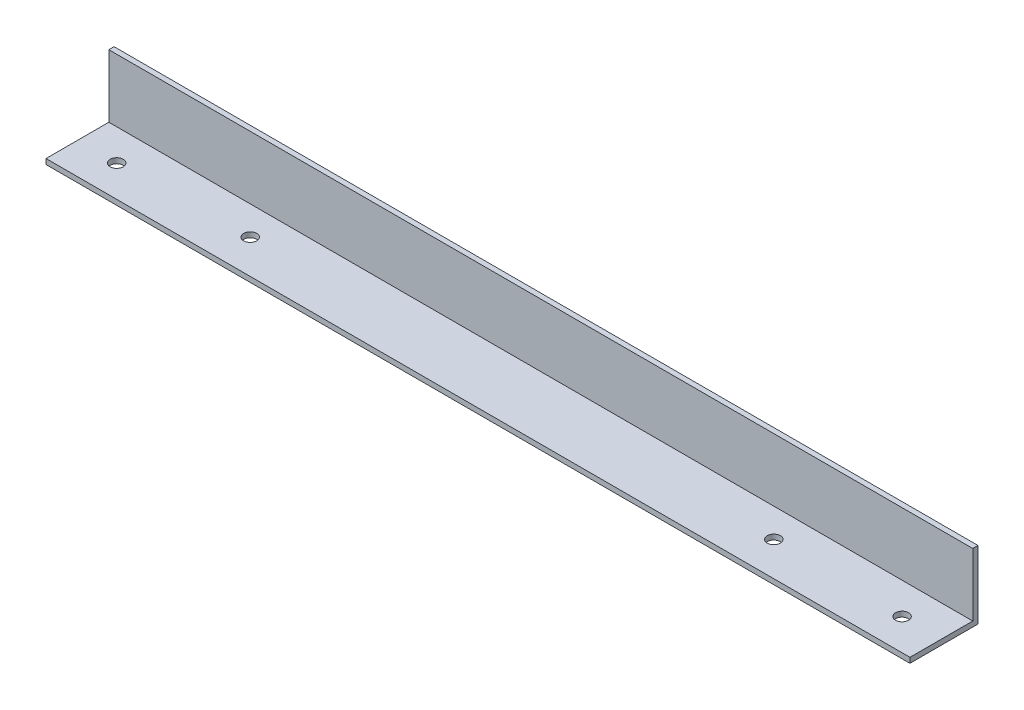
ISO-10303-21;
HEADER;
FILE_DESCRIPTION(('STEP AP214'),'2;1');
FILE_NAME('part.step','',(''),(''),'','','');
FILE_SCHEMA(('AUTOMOTIVE_DESIGN { 1 0 10303 214 1 1 1 1 }'));
ENDSEC;
DATA;
#1=APPLICATION_CONTEXT('core data for automotive mechanical design processes');
#2=APPLICATION_PROTOCOL_DEFINITION('international standard','automotive_design',2000,#1);
#3=PRODUCT_CONTEXT('',#1,'mechanical');
#4=PRODUCT('Part','Part','',(#3));
#5=PRODUCT_RELATED_PRODUCT_CATEGORY('part','',(#4));
#6=PRODUCT_DEFINITION_FORMATION('','',#4);
#7=PRODUCT_DEFINITION_CONTEXT('part definition',#1,'design');
#8=PRODUCT_DEFINITION('design','',#6,#7);
#9=PRODUCT_DEFINITION_SHAPE('','',#8);
#10=(LENGTH_UNIT() NAMED_UNIT(*) SI_UNIT(.MILLI.,.METRE.));
#11=(NAMED_UNIT(*) PLANE_ANGLE_UNIT() SI_UNIT($,.RADIAN.));
#12=(NAMED_UNIT(*) SI_UNIT($,.STERADIAN.) SOLID_ANGLE_UNIT());
#13=UNCERTAINTY_MEASURE_WITH_UNIT(LENGTH_MEASURE(1.E-05),#10,'distance_accuracy_value','');
#14=(GEOMETRIC_REPRESENTATION_CONTEXT(3) GLOBAL_UNCERTAINTY_ASSIGNED_CONTEXT((#13)) GLOBAL_UNIT_ASSIGNED_CONTEXT((#10,
#11,#12)) REPRESENTATION_CONTEXT('',''));
#15=CARTESIAN_POINT('',(0.,0.,0.));
#16=DIRECTION('',(0.,0.,1.));
#17=DIRECTION('',(1.,0.,0.));
#18=AXIS2_PLACEMENT_3D('',#15,#16,#17);
#19=CARTESIAN_POINT('',(165.,13.,-13.));
#20=DIRECTION('',(0.,0.,1.));
#21=DIRECTION('',(1.,0.,0.));
#22=AXIS2_PLACEMENT_3D('',#19,#20,#21);
#23=PLANE('',#22);
#24=DIRECTION('',(0.,1.,0.));
#25=VECTOR('',#24,1.);
#26=CARTESIAN_POINT('',(-165.,13.,-13.));
#27=LINE('',#26,#25);
#28=CARTESIAN_POINT('',(-165.,-13.,-13.));
#29=VERTEX_POINT('',#28);
#30=CARTESIAN_POINT('',(-165.,13.,-13.));
#31=VERTEX_POINT('',#30);
#32=EDGE_CURVE('E127',#29,#31,#27,.T.);
#33=ORIENTED_EDGE('',*,*,#32,.T.);
#34=DIRECTION('',(-1.,0.,0.));
#35=VECTOR('',#34,1.);
#36=CARTESIAN_POINT('',(165.,13.,-13.));
#37=LINE('',#36,#35);
#38=CARTESIAN_POINT('',(165.,13.,-13.));
#39=VERTEX_POINT('',#38);
#40=EDGE_CURVE('E11',#39,#31,#37,.T.);
#41=ORIENTED_EDGE('',*,*,#40,.F.);
#42=DIRECTION('',(0.,1.,0.));
#43=VECTOR('',#42,1.);
#44=CARTESIAN_POINT('',(165.,13.,-13.));
#45=LINE('',#44,#43);
#46=CARTESIAN_POINT('',(165.,-13.,-13.));
#47=VERTEX_POINT('',#46);
#48=EDGE_CURVE('E144',#47,#39,#45,.T.);
#49=ORIENTED_EDGE('',*,*,#48,.F.);
#50=DIRECTION('',(-1.,0.,0.));
#51=VECTOR('',#50,1.);
#52=CARTESIAN_POINT('',(165.,-13.,-13.));
#53=LINE('',#52,#51);
#54=EDGE_CURVE('E123',#47,#29,#53,.T.);
#55=ORIENTED_EDGE('',*,*,#54,.T.);
#56=EDGE_LOOP('',(#33,#41,#49,#55));
#57=FACE_BOUND('',#56,.T.);
#58=ADVANCED_FACE('F38',(#57),#23,.F.);
#59=CARTESIAN_POINT('',(165.,13.,-11.));
#60=DIRECTION('',(0.,-1.,0.));
#61=DIRECTION('',(0.,0.,-1.));
#62=AXIS2_PLACEMENT_3D('',#59,#60,#61);
#63=PLANE('',#62);
#64=DIRECTION('',(0.,0.,1.));
#65=VECTOR('',#64,1.);
#66=CARTESIAN_POINT('',(-165.,13.,-11.));
#67=LINE('',#66,#65);
#68=CARTESIAN_POINT('',(-165.,13.,-11.));
#69=VERTEX_POINT('',#68);
#70=EDGE_CURVE('E131',#31,#69,#67,.T.);
#71=ORIENTED_EDGE('',*,*,#70,.T.);
#72=DIRECTION('',(-1.,0.,0.));
#73=VECTOR('',#72,1.);
#74=CARTESIAN_POINT('',(165.,13.,-11.));
#75=LINE('',#74,#73);
#76=CARTESIAN_POINT('',(165.,13.,-11.));
#77=VERTEX_POINT('',#76);
#78=EDGE_CURVE('E47',#77,#69,#75,.T.);
#79=ORIENTED_EDGE('',*,*,#78,.F.);
#80=DIRECTION('',(0.,0.,1.));
#81=VECTOR('',#80,1.);
#82=CARTESIAN_POINT('',(165.,13.,-11.));
#83=LINE('',#82,#81);
#84=EDGE_CURVE('E92',#39,#77,#83,.T.);
#85=ORIENTED_EDGE('',*,*,#84,.F.);
#86=ORIENTED_EDGE('',*,*,#40,.T.);
#87=EDGE_LOOP('',(#71,#79,#85,#86));
#88=FACE_BOUND('',#87,.T.);
#89=ADVANCED_FACE('F177',(#88),#63,.F.);
#90=CARTESIAN_POINT('',(165.,13.,-11.));
#91=DIRECTION('',(0.,0.,-1.));
#92=DIRECTION('',(-1.,0.,0.));
#93=AXIS2_PLACEMENT_3D('',#90,#91,#92);
#94=PLANE('',#93);
#95=DIRECTION('',(0.,-1.,0.));
#96=VECTOR('',#95,1.);
#97=CARTESIAN_POINT('',(-165.,13.,-11.));
#98=LINE('',#97,#96);
#99=CARTESIAN_POINT('',(-165.,-11.,-11.));
#100=VERTEX_POINT('',#99);
#101=EDGE_CURVE('E135',#69,#100,#98,.T.);
#102=ORIENTED_EDGE('',*,*,#101,.T.);
#103=DIRECTION('',(-1.,0.,0.));
#104=VECTOR('',#103,1.);
#105=CARTESIAN_POINT('',(165.,-11.,-11.));
#106=LINE('',#105,#104);
#107=CARTESIAN_POINT('',(165.,-11.,-11.));
#108=VERTEX_POINT('',#107);
#109=EDGE_CURVE('E116',#108,#100,#106,.T.);
#110=ORIENTED_EDGE('',*,*,#109,.F.);
#111=DIRECTION('',(0.,-1.,0.));
#112=VECTOR('',#111,1.);
#113=CARTESIAN_POINT('',(165.,13.,-11.));
#114=LINE('',#113,#112);
#115=EDGE_CURVE('E105',#77,#108,#114,.T.);
#116=ORIENTED_EDGE('',*,*,#115,.F.);
#117=ORIENTED_EDGE('',*,*,#78,.T.);
#118=EDGE_LOOP('',(#102,#110,#116,#117));
#119=FACE_BOUND('',#118,.T.);
#120=ADVANCED_FACE('F154',(#119),#94,.F.);
#121=CARTESIAN_POINT('',(165.,-11.,13.));
#122=DIRECTION('',(0.,-1.,0.));
#123=DIRECTION('',(0.,0.,-1.));
#124=AXIS2_PLACEMENT_3D('',#121,#122,#123);
#125=PLANE('',#124);
#126=CARTESIAN_POINT('',(-100.,-11.,0.));
#127=DIRECTION('',(0.,-1.,0.));
#128=DIRECTION('',(0.,0.,-1.));
#129=AXIS2_PLACEMENT_3D('',#126,#127,#128);
#130=CIRCLE('',#129,2.50000000000001);
#131=CARTESIAN_POINT('',(-100.,-11.,-2.50000000000001));
#132=VERTEX_POINT('',#131);
#133=EDGE_CURVE('E193',#132,#132,#130,.F.);
#134=ORIENTED_EDGE('',*,*,#133,.F.);
#135=EDGE_LOOP('',(#134));
#136=FACE_BOUND('',#135,.T.);
#137=CARTESIAN_POINT('',(100.,-11.,0.));
#138=DIRECTION('',(0.,-1.,0.));
#139=DIRECTION('',(0.,0.,-1.));
#140=AXIS2_PLACEMENT_3D('',#137,#138,#139);
#141=CIRCLE('',#140,2.50000000000001);
#142=CARTESIAN_POINT('',(100.,-11.,-2.50000000000001));
#143=VERTEX_POINT('',#142);
#144=EDGE_CURVE('E197',#143,#143,#141,.T.);
#145=ORIENTED_EDGE('',*,*,#144,.T.);
#146=EDGE_LOOP('',(#145));
#147=FACE_BOUND('',#146,.T.);
#148=CARTESIAN_POINT('',(-150.,-11.,0.999999999999999));
#149=DIRECTION('',(0.,-1.,0.));
#150=DIRECTION('',(0.,0.,-1.));
#151=AXIS2_PLACEMENT_3D('',#148,#149,#150);
#152=CIRCLE('',#151,2.5);
#153=CARTESIAN_POINT('',(-150.,-11.,-1.5));
#154=VERTEX_POINT('',#153);
#155=EDGE_CURVE('E201',#154,#154,#152,.F.);
#156=ORIENTED_EDGE('',*,*,#155,.F.);
#157=EDGE_LOOP('',(#156));
#158=FACE_BOUND('',#157,.T.);
#159=CARTESIAN_POINT('',(150.,-11.,0.999999999999999));
#160=DIRECTION('',(0.,-1.,0.));
#161=DIRECTION('',(0.,0.,-1.));
#162=AXIS2_PLACEMENT_3D('',#159,#160,#161);
#163=CIRCLE('',#162,2.5);
#164=CARTESIAN_POINT('',(150.,-11.,-1.5));
#165=VERTEX_POINT('',#164);
#166=EDGE_CURVE('E132',#165,#165,#163,.T.);
#167=ORIENTED_EDGE('',*,*,#166,.T.);
#168=EDGE_LOOP('',(#167));
#169=FACE_BOUND('',#168,.T.);
#170=DIRECTION('',(0.,0.,1.));
#171=VECTOR('',#170,1.);
#172=CARTESIAN_POINT('',(-165.,-11.,13.));
#173=LINE('',#172,#171);
#174=CARTESIAN_POINT('',(-165.,-11.,13.));
#175=VERTEX_POINT('',#174);
#176=EDGE_CURVE('E114',#100,#175,#173,.T.);
#177=ORIENTED_EDGE('',*,*,#176,.T.);
#178=DIRECTION('',(-1.,0.,0.));
#179=VECTOR('',#178,1.);
#180=CARTESIAN_POINT('',(165.,-11.,13.));
#181=LINE('',#180,#179);
#182=CARTESIAN_POINT('',(165.,-11.,13.));
#183=VERTEX_POINT('',#182);
#184=EDGE_CURVE('E111',#183,#175,#181,.T.);
#185=ORIENTED_EDGE('',*,*,#184,.F.);
#186=DIRECTION('',(0.,0.,1.));
#187=VECTOR('',#186,1.);
#188=CARTESIAN_POINT('',(165.,-11.,13.));
#189=LINE('',#188,#187);
#190=EDGE_CURVE('E99',#108,#183,#189,.T.);
#191=ORIENTED_EDGE('',*,*,#190,.F.);
#192=ORIENTED_EDGE('',*,*,#109,.T.);
#193=EDGE_LOOP('',(#177,#185,#191,#192));
#194=FACE_BOUND('',#193,.T.);
#195=ADVANCED_FACE('F112',(#136,#147,#158,#169,#194),#125,.F.);
#196=CARTESIAN_POINT('',(165.,-11.,13.));
#197=DIRECTION('',(0.,0.,-1.));
#198=DIRECTION('',(0.,1.,0.));
#199=AXIS2_PLACEMENT_3D('',#196,#197,#198);
#200=PLANE('',#199);
#201=DIRECTION('',(0.,-1.,0.));
#202=VECTOR('',#201,1.);
#203=CARTESIAN_POINT('',(-165.,-11.,13.));
#204=LINE('',#203,#202);
#205=CARTESIAN_POINT('',(-165.,-13.,13.));
#206=VERTEX_POINT('',#205);
#207=EDGE_CURVE('E78',#175,#206,#204,.T.);
#208=ORIENTED_EDGE('',*,*,#207,.T.);
#209=DIRECTION('',(-1.,0.,0.));
#210=VECTOR('',#209,1.);
#211=CARTESIAN_POINT('',(165.,-13.,13.));
#212=LINE('',#211,#210);
#213=CARTESIAN_POINT('',(165.,-13.,13.));
#214=VERTEX_POINT('',#213);
#215=EDGE_CURVE('E117',#214,#206,#212,.T.);
#216=ORIENTED_EDGE('',*,*,#215,.F.);
#217=DIRECTION('',(0.,-1.,0.));
#218=VECTOR('',#217,1.);
#219=CARTESIAN_POINT('',(165.,-11.,13.));
#220=LINE('',#219,#218);
#221=EDGE_CURVE('E103',#183,#214,#220,.T.);
#222=ORIENTED_EDGE('',*,*,#221,.F.);
#223=ORIENTED_EDGE('',*,*,#184,.T.);
#224=EDGE_LOOP('',(#208,#216,#222,#223));
#225=FACE_BOUND('',#224,.T.);
#226=ADVANCED_FACE('F119',(#225),#200,.F.);
#227=CARTESIAN_POINT('',(165.,-13.,13.));
#228=DIRECTION('',(0.,1.,0.));
#229=DIRECTION('',(0.,0.,1.));
#230=AXIS2_PLACEMENT_3D('',#227,#228,#229);
#231=PLANE('',#230);
#232=CARTESIAN_POINT('',(-100.,-13.,0.));
#233=DIRECTION('',(0.,-1.,0.));
#234=DIRECTION('',(0.,0.,1.));
#235=AXIS2_PLACEMENT_3D('',#232,#233,#234);
#236=CIRCLE('',#235,2.50000000000001);
#237=CARTESIAN_POINT('',(-100.,-13.,2.50000000000001));
#238=VERTEX_POINT('',#237);
#239=EDGE_CURVE('E231',#238,#238,#236,.T.);
#240=ORIENTED_EDGE('',*,*,#239,.F.);
#241=EDGE_LOOP('',(#240));
#242=FACE_BOUND('',#241,.T.);
#243=CARTESIAN_POINT('',(100.,-13.,0.));
#244=DIRECTION('',(0.,1.,0.));
#245=DIRECTION('',(0.,0.,1.));
#246=AXIS2_PLACEMENT_3D('',#243,#244,#245);
#247=CIRCLE('',#246,2.50000000000001);
#248=CARTESIAN_POINT('',(100.,-13.,2.50000000000001));
#249=VERTEX_POINT('',#248);
#250=EDGE_CURVE('E225',#249,#249,#247,.T.);
#251=ORIENTED_EDGE('',*,*,#250,.T.);
#252=EDGE_LOOP('',(#251));
#253=FACE_BOUND('',#252,.T.);
#254=CARTESIAN_POINT('',(-150.,-13.,0.999999999999999));
#255=DIRECTION('',(0.,-1.,0.));
#256=DIRECTION('',(0.,0.,1.));
#257=AXIS2_PLACEMENT_3D('',#254,#255,#256);
#258=CIRCLE('',#257,2.5);
#259=CARTESIAN_POINT('',(-150.,-13.,3.49999999999999));
#260=VERTEX_POINT('',#259);
#261=EDGE_CURVE('E219',#260,#260,#258,.T.);
#262=ORIENTED_EDGE('',*,*,#261,.F.);
#263=EDGE_LOOP('',(#262));
#264=FACE_BOUND('',#263,.T.);
#265=CARTESIAN_POINT('',(150.,-13.,0.999999999999999));
#266=DIRECTION('',(0.,1.,0.));
#267=DIRECTION('',(0.,0.,1.));
#268=AXIS2_PLACEMENT_3D('',#265,#266,#267);
#269=CIRCLE('',#268,2.5);
#270=CARTESIAN_POINT('',(150.,-13.,3.49999999999999));
#271=VERTEX_POINT('',#270);
#272=EDGE_CURVE('E206',#271,#271,#269,.T.);
#273=ORIENTED_EDGE('',*,*,#272,.T.);
#274=EDGE_LOOP('',(#273));
#275=FACE_BOUND('',#274,.T.);
#276=DIRECTION('',(0.,0.,-1.));
#277=VECTOR('',#276,1.);
#278=CARTESIAN_POINT('',(-165.,-13.,13.));
#279=LINE('',#278,#277);
#280=EDGE_CURVE('E84',#206,#29,#279,.T.);
#281=ORIENTED_EDGE('',*,*,#280,.T.);
#282=ORIENTED_EDGE('',*,*,#54,.F.);
#283=DIRECTION('',(0.,0.,-1.));
#284=VECTOR('',#283,1.);
#285=CARTESIAN_POINT('',(165.,-13.,13.));
#286=LINE('',#285,#284);
#287=EDGE_CURVE('E55',#214,#47,#286,.T.);
#288=ORIENTED_EDGE('',*,*,#287,.F.);
#289=ORIENTED_EDGE('',*,*,#215,.T.);
#290=EDGE_LOOP('',(#281,#282,#288,#289));
#291=FACE_BOUND('',#290,.T.);
#292=ADVANCED_FACE('F161',(#242,#253,#264,#275,#291),#231,.F.);
#293=CARTESIAN_POINT('',(165.,0.,0.));
#294=DIRECTION('',(1.,0.,0.));
#295=DIRECTION('',(0.,0.,-1.));
#296=AXIS2_PLACEMENT_3D('',#293,#294,#295);
#297=PLANE('',#296);
#298=ORIENTED_EDGE('',*,*,#48,.T.);
#299=ORIENTED_EDGE('',*,*,#84,.T.);
#300=ORIENTED_EDGE('',*,*,#115,.T.);
#301=ORIENTED_EDGE('',*,*,#190,.T.);
#302=ORIENTED_EDGE('',*,*,#221,.T.);
#303=ORIENTED_EDGE('',*,*,#287,.T.);
#304=EDGE_LOOP('',(#298,#299,#300,#301,#302,#303));
#305=FACE_BOUND('',#304,.T.);
#306=ADVANCED_FACE('F101',(#305),#297,.T.);
#307=CARTESIAN_POINT('',(-165.,0.,0.));
#308=DIRECTION('',(1.,0.,0.));
#309=DIRECTION('',(0.,0.,-1.));
#310=AXIS2_PLACEMENT_3D('',#307,#308,#309);
#311=PLANE('',#310);
#312=ORIENTED_EDGE('',*,*,#32,.F.);
#313=ORIENTED_EDGE('',*,*,#280,.F.);
#314=ORIENTED_EDGE('',*,*,#207,.F.);
#315=ORIENTED_EDGE('',*,*,#176,.F.);
#316=ORIENTED_EDGE('',*,*,#101,.F.);
#317=ORIENTED_EDGE('',*,*,#70,.F.);
#318=EDGE_LOOP('',(#312,#313,#314,#315,#316,#317));
#319=FACE_BOUND('',#318,.T.);
#320=ADVANCED_FACE('F157',(#319),#311,.F.);
#321=CARTESIAN_POINT('',(150.,-13.,0.999999999999999));
#322=DIRECTION('',(0.,1.,0.));
#323=DIRECTION('',(0.,0.,1.));
#324=AXIS2_PLACEMENT_3D('',#321,#322,#323);
#325=CYLINDRICAL_SURFACE('',#324,2.5);
#326=ORIENTED_EDGE('',*,*,#272,.F.);
#327=EDGE_LOOP('',(#326));
#328=FACE_BOUND('',#327,.T.);
#329=ORIENTED_EDGE('',*,*,#166,.F.);
#330=EDGE_LOOP('',(#329));
#331=FACE_BOUND('',#330,.T.);
#332=ADVANCED_FACE('F248',(#328,#331),#325,.F.);
#333=CARTESIAN_POINT('',(-150.,-13.,0.999999999999999));
#334=DIRECTION('',(0.,1.,0.));
#335=DIRECTION('',(0.,0.,1.));
#336=AXIS2_PLACEMENT_3D('',#333,#334,#335);
#337=CYLINDRICAL_SURFACE('',#336,2.5);
#338=ORIENTED_EDGE('',*,*,#261,.T.);
#339=EDGE_LOOP('',(#338));
#340=FACE_BOUND('',#339,.T.);
#341=ORIENTED_EDGE('',*,*,#155,.T.);
#342=EDGE_LOOP('',(#341));
#343=FACE_BOUND('',#342,.T.);
#344=ADVANCED_FACE('F242',(#340,#343),#337,.F.);
#345=CARTESIAN_POINT('',(100.,-13.,0.));
#346=DIRECTION('',(0.,1.,0.));
#347=DIRECTION('',(0.,0.,1.));
#348=AXIS2_PLACEMENT_3D('',#345,#346,#347);
#349=CYLINDRICAL_SURFACE('',#348,2.50000000000001);
#350=ORIENTED_EDGE('',*,*,#250,.F.);
#351=EDGE_LOOP('',(#350));
#352=FACE_BOUND('',#351,.T.);
#353=ORIENTED_EDGE('',*,*,#144,.F.);
#354=EDGE_LOOP('',(#353));
#355=FACE_BOUND('',#354,.T.);
#356=ADVANCED_FACE('F238',(#352,#355),#349,.F.);
#357=CARTESIAN_POINT('',(-100.,-13.,0.));
#358=DIRECTION('',(0.,1.,0.));
#359=DIRECTION('',(0.,0.,1.));
#360=AXIS2_PLACEMENT_3D('',#357,#358,#359);
#361=CYLINDRICAL_SURFACE('',#360,2.50000000000001);
#362=ORIENTED_EDGE('',*,*,#239,.T.);
#363=EDGE_LOOP('',(#362));
#364=FACE_BOUND('',#363,.T.);
#365=ORIENTED_EDGE('',*,*,#133,.T.);
#366=EDGE_LOOP('',(#365));
#367=FACE_BOUND('',#366,.T.);
#368=ADVANCED_FACE('F235',(#364,#367),#361,.F.);
#369=CLOSED_SHELL('',(#58,#89,#120,#195,#226,#292,#306,#320,#332,#344,#356,#368));
#370=MANIFOLD_SOLID_BREP('B2',#369);
#371=ADVANCED_BREP_SHAPE_REPRESENTATION('',(#18,#370),#14);
#372=SHAPE_DEFINITION_REPRESENTATION(#9,#371);
ENDSEC;
END-ISO-10303-21;
